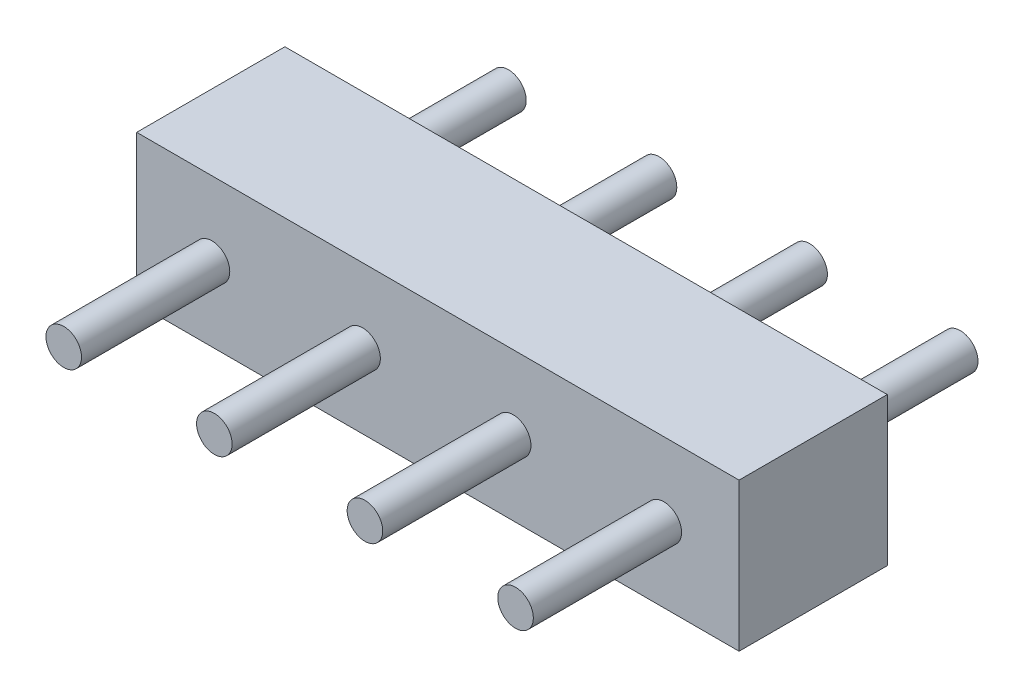
ISO-10303-21;
HEADER;
FILE_DESCRIPTION(('STEP AP214'),'2;1');
FILE_NAME('part.step','',(''),(''),'','','');
FILE_SCHEMA(('AUTOMOTIVE_DESIGN { 1 0 10303 214 1 1 1 1 }'));
ENDSEC;
DATA;
#1=APPLICATION_CONTEXT('core data for automotive mechanical design processes');
#2=APPLICATION_PROTOCOL_DEFINITION('international standard','automotive_design',2000,#1);
#3=PRODUCT_CONTEXT('',#1,'mechanical');
#4=PRODUCT('Part','Part','',(#3));
#5=PRODUCT_RELATED_PRODUCT_CATEGORY('part','',(#4));
#6=PRODUCT_DEFINITION_FORMATION('','',#4);
#7=PRODUCT_DEFINITION_CONTEXT('part definition',#1,'design');
#8=PRODUCT_DEFINITION('design','',#6,#7);
#9=PRODUCT_DEFINITION_SHAPE('','',#8);
#10=(LENGTH_UNIT() NAMED_UNIT(*) SI_UNIT(.MILLI.,.METRE.));
#11=(NAMED_UNIT(*) PLANE_ANGLE_UNIT() SI_UNIT($,.RADIAN.));
#12=(NAMED_UNIT(*) SI_UNIT($,.STERADIAN.) SOLID_ANGLE_UNIT());
#13=UNCERTAINTY_MEASURE_WITH_UNIT(LENGTH_MEASURE(1.E-05),#10,'distance_accuracy_value','');
#14=(GEOMETRIC_REPRESENTATION_CONTEXT(3) GLOBAL_UNCERTAINTY_ASSIGNED_CONTEXT((#13)) GLOBAL_UNIT_ASSIGNED_CONTEXT((#10,
#11,#12)) REPRESENTATION_CONTEXT('',''));
#15=CARTESIAN_POINT('',(0.,0.,0.));
#16=DIRECTION('',(0.,0.,1.));
#17=DIRECTION('',(1.,0.,0.));
#18=AXIS2_PLACEMENT_3D('',#15,#16,#17);
#19=CARTESIAN_POINT('',(0.,0.,2.5));
#20=DIRECTION('',(1.,0.,0.));
#21=DIRECTION('',(0.,0.,-1.));
#22=AXIS2_PLACEMENT_3D('',#19,#20,#21);
#23=PLANE('',#22);
#24=DIRECTION('',(0.,-1.,0.));
#25=VECTOR('',#24,1.);
#26=CARTESIAN_POINT('',(0.,0.,0.));
#27=LINE('',#26,#25);
#28=CARTESIAN_POINT('',(0.,2.5,0.));
#29=VERTEX_POINT('',#28);
#30=CARTESIAN_POINT('',(0.,0.,0.));
#31=VERTEX_POINT('',#30);
#32=EDGE_CURVE('E103',#29,#31,#27,.T.);
#33=ORIENTED_EDGE('',*,*,#32,.T.);
#34=DIRECTION('',(0.,0.,-1.));
#35=VECTOR('',#34,1.);
#36=CARTESIAN_POINT('',(0.,0.,2.5));
#37=LINE('',#36,#35);
#38=CARTESIAN_POINT('',(0.,0.,2.5));
#39=VERTEX_POINT('',#38);
#40=EDGE_CURVE('E94',#39,#31,#37,.T.);
#41=ORIENTED_EDGE('',*,*,#40,.F.);
#42=DIRECTION('',(0.,-1.,0.));
#43=VECTOR('',#42,1.);
#44=CARTESIAN_POINT('',(0.,0.,2.5));
#45=LINE('',#44,#43);
#46=CARTESIAN_POINT('',(0.,2.5,2.5));
#47=VERTEX_POINT('',#46);
#48=EDGE_CURVE('E88',#47,#39,#45,.T.);
#49=ORIENTED_EDGE('',*,*,#48,.F.);
#50=DIRECTION('',(0.,0.,-1.));
#51=VECTOR('',#50,1.);
#52=CARTESIAN_POINT('',(0.,2.5,2.5));
#53=LINE('',#52,#51);
#54=EDGE_CURVE('E99',#47,#29,#53,.T.);
#55=ORIENTED_EDGE('',*,*,#54,.T.);
#56=EDGE_LOOP('',(#33,#41,#49,#55));
#57=FACE_BOUND('',#56,.T.);
#58=ADVANCED_FACE('F36',(#57),#23,.F.);
#59=CARTESIAN_POINT('',(0.,0.,2.5));
#60=DIRECTION('',(0.,1.,0.));
#61=DIRECTION('',(0.,0.,1.));
#62=AXIS2_PLACEMENT_3D('',#59,#60,#61);
#63=PLANE('',#62);
#64=DIRECTION('',(1.,0.,0.));
#65=VECTOR('',#64,1.);
#66=CARTESIAN_POINT('',(0.,0.,0.));
#67=LINE('',#66,#65);
#68=CARTESIAN_POINT('',(10.16,0.,0.));
#69=VERTEX_POINT('',#68);
#70=EDGE_CURVE('E93',#31,#69,#67,.T.);
#71=ORIENTED_EDGE('',*,*,#70,.T.);
#72=DIRECTION('',(0.,0.,-1.));
#73=VECTOR('',#72,1.);
#74=CARTESIAN_POINT('',(10.16,0.,2.5));
#75=LINE('',#74,#73);
#76=CARTESIAN_POINT('',(10.16,0.,2.5));
#77=VERTEX_POINT('',#76);
#78=EDGE_CURVE('E91',#77,#69,#75,.T.);
#79=ORIENTED_EDGE('',*,*,#78,.F.);
#80=DIRECTION('',(1.,0.,0.));
#81=VECTOR('',#80,1.);
#82=CARTESIAN_POINT('',(0.,0.,2.5));
#83=LINE('',#82,#81);
#84=EDGE_CURVE('E83',#39,#77,#83,.T.);
#85=ORIENTED_EDGE('',*,*,#84,.F.);
#86=ORIENTED_EDGE('',*,*,#40,.T.);
#87=EDGE_LOOP('',(#71,#79,#85,#86));
#88=FACE_BOUND('',#87,.T.);
#89=ADVANCED_FACE('F92',(#88),#63,.F.);
#90=CARTESIAN_POINT('',(10.16,0.,2.5));
#91=DIRECTION('',(-1.,0.,0.));
#92=DIRECTION('',(0.,0.,1.));
#93=AXIS2_PLACEMENT_3D('',#90,#91,#92);
#94=PLANE('',#93);
#95=DIRECTION('',(0.,1.,0.));
#96=VECTOR('',#95,1.);
#97=CARTESIAN_POINT('',(10.16,0.,0.));
#98=LINE('',#97,#96);
#99=CARTESIAN_POINT('',(10.16,2.5,0.));
#100=VERTEX_POINT('',#99);
#101=EDGE_CURVE('E69',#69,#100,#98,.T.);
#102=ORIENTED_EDGE('',*,*,#101,.T.);
#103=DIRECTION('',(0.,0.,-1.));
#104=VECTOR('',#103,1.);
#105=CARTESIAN_POINT('',(10.16,2.5,2.5));
#106=LINE('',#105,#104);
#107=CARTESIAN_POINT('',(10.16,2.5,2.5));
#108=VERTEX_POINT('',#107);
#109=EDGE_CURVE('E95',#108,#100,#106,.T.);
#110=ORIENTED_EDGE('',*,*,#109,.F.);
#111=DIRECTION('',(0.,1.,0.));
#112=VECTOR('',#111,1.);
#113=CARTESIAN_POINT('',(10.16,0.,2.5));
#114=LINE('',#113,#112);
#115=EDGE_CURVE('E86',#77,#108,#114,.T.);
#116=ORIENTED_EDGE('',*,*,#115,.F.);
#117=ORIENTED_EDGE('',*,*,#78,.T.);
#118=EDGE_LOOP('',(#102,#110,#116,#117));
#119=FACE_BOUND('',#118,.T.);
#120=ADVANCED_FACE('F97',(#119),#94,.F.);
#121=CARTESIAN_POINT('',(0.,2.5,2.5));
#122=DIRECTION('',(0.,-1.,0.));
#123=DIRECTION('',(0.,0.,-1.));
#124=AXIS2_PLACEMENT_3D('',#121,#122,#123);
#125=PLANE('',#124);
#126=DIRECTION('',(-1.,0.,0.));
#127=VECTOR('',#126,1.);
#128=CARTESIAN_POINT('',(0.,2.5,0.));
#129=LINE('',#128,#127);
#130=EDGE_CURVE('E75',#100,#29,#129,.T.);
#131=ORIENTED_EDGE('',*,*,#130,.T.);
#132=ORIENTED_EDGE('',*,*,#54,.F.);
#133=DIRECTION('',(-1.,0.,0.));
#134=VECTOR('',#133,1.);
#135=CARTESIAN_POINT('',(0.,2.5,2.5));
#136=LINE('',#135,#134);
#137=EDGE_CURVE('E52',#108,#47,#136,.T.);
#138=ORIENTED_EDGE('',*,*,#137,.F.);
#139=ORIENTED_EDGE('',*,*,#109,.T.);
#140=EDGE_LOOP('',(#131,#132,#138,#139));
#141=FACE_BOUND('',#140,.T.);
#142=ADVANCED_FACE('F136',(#141),#125,.F.);
#143=CARTESIAN_POINT('',(0.,0.,2.5));
#144=DIRECTION('',(0.,0.,-1.));
#145=DIRECTION('',(-1.,0.,0.));
#146=AXIS2_PLACEMENT_3D('',#143,#144,#145);
#147=PLANE('',#146);
#148=CARTESIAN_POINT('',(8.89,1.25,2.5));
#149=DIRECTION('',(0.,0.,-1.));
#150=DIRECTION('',(-1.,0.,0.));
#151=AXIS2_PLACEMENT_3D('',#148,#149,#150);
#152=CIRCLE('',#151,0.3);
#153=CARTESIAN_POINT('',(8.59,1.25,2.5));
#154=VERTEX_POINT('',#153);
#155=EDGE_CURVE('E335',#154,#154,#152,.T.);
#156=ORIENTED_EDGE('',*,*,#155,.T.);
#157=EDGE_LOOP('',(#156));
#158=FACE_BOUND('',#157,.T.);
#159=CARTESIAN_POINT('',(6.35,1.25,2.5));
#160=DIRECTION('',(0.,0.,-1.));
#161=DIRECTION('',(-1.,0.,0.));
#162=AXIS2_PLACEMENT_3D('',#159,#160,#161);
#163=CIRCLE('',#162,0.3);
#164=CARTESIAN_POINT('',(6.05,1.25,2.5));
#165=VERTEX_POINT('',#164);
#166=EDGE_CURVE('E346',#165,#165,#163,.T.);
#167=ORIENTED_EDGE('',*,*,#166,.T.);
#168=EDGE_LOOP('',(#167));
#169=FACE_BOUND('',#168,.T.);
#170=CARTESIAN_POINT('',(1.27,1.25,2.5));
#171=DIRECTION('',(0.,0.,-1.));
#172=DIRECTION('',(-1.,0.,0.));
#173=AXIS2_PLACEMENT_3D('',#170,#171,#172);
#174=CIRCLE('',#173,0.3);
#175=CARTESIAN_POINT('',(0.970000000000001,1.25,2.5));
#176=VERTEX_POINT('',#175);
#177=EDGE_CURVE('E355',#176,#176,#174,.T.);
#178=ORIENTED_EDGE('',*,*,#177,.T.);
#179=EDGE_LOOP('',(#178));
#180=FACE_BOUND('',#179,.T.);
#181=CARTESIAN_POINT('',(3.81,1.25,2.5));
#182=DIRECTION('',(0.,0.,-1.));
#183=DIRECTION('',(-1.,0.,0.));
#184=AXIS2_PLACEMENT_3D('',#181,#182,#183);
#185=CIRCLE('',#184,0.3);
#186=CARTESIAN_POINT('',(3.51,1.25,2.5));
#187=VERTEX_POINT('',#186);
#188=EDGE_CURVE('E106',#187,#187,#185,.T.);
#189=ORIENTED_EDGE('',*,*,#188,.T.);
#190=EDGE_LOOP('',(#189));
#191=FACE_BOUND('',#190,.T.);
#192=ORIENTED_EDGE('',*,*,#48,.T.);
#193=ORIENTED_EDGE('',*,*,#84,.T.);
#194=ORIENTED_EDGE('',*,*,#115,.T.);
#195=ORIENTED_EDGE('',*,*,#137,.T.);
#196=EDGE_LOOP('',(#192,#193,#194,#195));
#197=FACE_BOUND('',#196,.T.);
#198=ADVANCED_FACE('F84',(#158,#169,#180,#191,#197),#147,.F.);
#199=CARTESIAN_POINT('',(0.,0.,0.));
#200=DIRECTION('',(0.,0.,-1.));
#201=DIRECTION('',(-1.,0.,0.));
#202=AXIS2_PLACEMENT_3D('',#199,#200,#201);
#203=PLANE('',#202);
#204=CARTESIAN_POINT('',(8.89,1.25,0.));
#205=DIRECTION('',(0.,0.,-1.));
#206=DIRECTION('',(-1.,0.,0.));
#207=AXIS2_PLACEMENT_3D('',#204,#205,#206);
#208=CIRCLE('',#207,0.3);
#209=CARTESIAN_POINT('',(8.59,1.25,0.));
#210=VERTEX_POINT('',#209);
#211=EDGE_CURVE('E11',#210,#210,#208,.T.);
#212=ORIENTED_EDGE('',*,*,#211,.F.);
#213=EDGE_LOOP('',(#212));
#214=FACE_BOUND('',#213,.T.);
#215=CARTESIAN_POINT('',(6.35,1.25,0.));
#216=DIRECTION('',(0.,0.,-1.));
#217=DIRECTION('',(-1.,0.,0.));
#218=AXIS2_PLACEMENT_3D('',#215,#216,#217);
#219=CIRCLE('',#218,0.3);
#220=CARTESIAN_POINT('',(6.05,1.25,0.));
#221=VERTEX_POINT('',#220);
#222=EDGE_CURVE('E44',#221,#221,#219,.T.);
#223=ORIENTED_EDGE('',*,*,#222,.F.);
#224=EDGE_LOOP('',(#223));
#225=FACE_BOUND('',#224,.T.);
#226=CARTESIAN_POINT('',(1.27,1.25,0.));
#227=DIRECTION('',(0.,0.,-1.));
#228=DIRECTION('',(-1.,0.,0.));
#229=AXIS2_PLACEMENT_3D('',#226,#227,#228);
#230=CIRCLE('',#229,0.3);
#231=CARTESIAN_POINT('',(0.970000000000001,1.25,0.));
#232=VERTEX_POINT('',#231);
#233=EDGE_CURVE('E116',#232,#232,#230,.T.);
#234=ORIENTED_EDGE('',*,*,#233,.F.);
#235=EDGE_LOOP('',(#234));
#236=FACE_BOUND('',#235,.T.);
#237=CARTESIAN_POINT('',(3.81,1.25,0.));
#238=DIRECTION('',(0.,0.,-1.));
#239=DIRECTION('',(-1.,0.,0.));
#240=AXIS2_PLACEMENT_3D('',#237,#238,#239);
#241=CIRCLE('',#240,0.3);
#242=CARTESIAN_POINT('',(3.51,1.25,0.));
#243=VERTEX_POINT('',#242);
#244=EDGE_CURVE('E113',#243,#243,#241,.T.);
#245=ORIENTED_EDGE('',*,*,#244,.F.);
#246=EDGE_LOOP('',(#245));
#247=FACE_BOUND('',#246,.T.);
#248=ORIENTED_EDGE('',*,*,#32,.F.);
#249=ORIENTED_EDGE('',*,*,#130,.F.);
#250=ORIENTED_EDGE('',*,*,#101,.F.);
#251=ORIENTED_EDGE('',*,*,#70,.F.);
#252=EDGE_LOOP('',(#248,#249,#250,#251));
#253=FACE_BOUND('',#252,.T.);
#254=ADVANCED_FACE('F124',(#214,#225,#236,#247,#253),#203,.T.);
#255=CARTESIAN_POINT('',(3.81,1.25,-2.5));
#256=DIRECTION('',(0.,0.,1.));
#257=DIRECTION('',(1.,0.,0.));
#258=AXIS2_PLACEMENT_3D('',#255,#256,#257);
#259=PLANE('',#258);
#260=CARTESIAN_POINT('',(3.81,1.25,-2.5));
#261=DIRECTION('',(0.,0.,1.));
#262=DIRECTION('',(1.,0.,0.));
#263=AXIS2_PLACEMENT_3D('',#260,#261,#262);
#264=CIRCLE('',#263,0.3);
#265=CARTESIAN_POINT('',(4.11,1.25,-2.5));
#266=VERTEX_POINT('',#265);
#267=EDGE_CURVE('E361',#266,#266,#264,.T.);
#268=ORIENTED_EDGE('',*,*,#267,.F.);
#269=EDGE_LOOP('',(#268));
#270=FACE_BOUND('',#269,.T.);
#271=ADVANCED_FACE('F127',(#270),#259,.F.);
#272=CARTESIAN_POINT('',(3.81,1.25,-2.5));
#273=DIRECTION('',(0.,0.,1.));
#274=DIRECTION('',(1.,0.,0.));
#275=AXIS2_PLACEMENT_3D('',#272,#273,#274);
#276=CYLINDRICAL_SURFACE('',#275,0.3);
#277=ORIENTED_EDGE('',*,*,#244,.T.);
#278=EDGE_LOOP('',(#277));
#279=FACE_BOUND('',#278,.T.);
#280=ORIENTED_EDGE('',*,*,#267,.T.);
#281=EDGE_LOOP('',(#280));
#282=FACE_BOUND('',#281,.T.);
#283=ADVANCED_FACE('F170',(#279,#282),#276,.T.);
#284=CARTESIAN_POINT('',(3.81,1.25,5.));
#285=DIRECTION('',(0.,0.,1.));
#286=DIRECTION('',(1.,0.,0.));
#287=AXIS2_PLACEMENT_3D('',#284,#285,#286);
#288=CIRCLE('',#287,0.3);
#289=CARTESIAN_POINT('',(4.11,1.25,5.));
#290=VERTEX_POINT('',#289);
#291=EDGE_CURVE('E358',#290,#290,#288,.T.);
#292=ORIENTED_EDGE('',*,*,#291,.F.);
#293=EDGE_LOOP('',(#292));
#294=FACE_BOUND('',#293,.T.);
#295=ORIENTED_EDGE('',*,*,#188,.F.);
#296=EDGE_LOOP('',(#295));
#297=FACE_BOUND('',#296,.T.);
#298=ADVANCED_FACE('F181',(#294,#297),#276,.T.);
#299=CARTESIAN_POINT('',(3.81,1.25,5.));
#300=DIRECTION('',(0.,0.,1.));
#301=DIRECTION('',(1.,0.,0.));
#302=AXIS2_PLACEMENT_3D('',#299,#300,#301);
#303=PLANE('',#302);
#304=ORIENTED_EDGE('',*,*,#291,.T.);
#305=EDGE_LOOP('',(#304));
#306=FACE_BOUND('',#305,.T.);
#307=ADVANCED_FACE('F191',(#306),#303,.T.);
#308=CARTESIAN_POINT('',(1.27,1.25,-2.5));
#309=DIRECTION('',(0.,0.,1.));
#310=DIRECTION('',(1.,0.,0.));
#311=AXIS2_PLACEMENT_3D('',#308,#309,#310);
#312=PLANE('',#311);
#313=CARTESIAN_POINT('',(1.27,1.25,-2.5));
#314=DIRECTION('',(0.,0.,1.));
#315=DIRECTION('',(1.,0.,0.));
#316=AXIS2_PLACEMENT_3D('',#313,#314,#315);
#317=CIRCLE('',#316,0.3);
#318=CARTESIAN_POINT('',(1.57,1.25,-2.5));
#319=VERTEX_POINT('',#318);
#320=EDGE_CURVE('E352',#319,#319,#317,.T.);
#321=ORIENTED_EDGE('',*,*,#320,.F.);
#322=EDGE_LOOP('',(#321));
#323=FACE_BOUND('',#322,.T.);
#324=ADVANCED_FACE('F200',(#323),#312,.F.);
#325=CARTESIAN_POINT('',(1.27,1.25,-2.5));
#326=DIRECTION('',(0.,0.,1.));
#327=DIRECTION('',(1.,0.,0.));
#328=AXIS2_PLACEMENT_3D('',#325,#326,#327);
#329=CYLINDRICAL_SURFACE('',#328,0.3);
#330=ORIENTED_EDGE('',*,*,#233,.T.);
#331=EDGE_LOOP('',(#330));
#332=FACE_BOUND('',#331,.T.);
#333=ORIENTED_EDGE('',*,*,#320,.T.);
#334=EDGE_LOOP('',(#333));
#335=FACE_BOUND('',#334,.T.);
#336=ADVANCED_FACE('F220',(#332,#335),#329,.T.);
#337=CARTESIAN_POINT('',(1.27,1.25,5.));
#338=DIRECTION('',(0.,0.,1.));
#339=DIRECTION('',(1.,0.,0.));
#340=AXIS2_PLACEMENT_3D('',#337,#338,#339);
#341=CIRCLE('',#340,0.3);
#342=CARTESIAN_POINT('',(1.57,1.25,5.));
#343=VERTEX_POINT('',#342);
#344=EDGE_CURVE('E349',#343,#343,#341,.T.);
#345=ORIENTED_EDGE('',*,*,#344,.F.);
#346=EDGE_LOOP('',(#345));
#347=FACE_BOUND('',#346,.T.);
#348=ORIENTED_EDGE('',*,*,#177,.F.);
#349=EDGE_LOOP('',(#348));
#350=FACE_BOUND('',#349,.T.);
#351=ADVANCED_FACE('F230',(#347,#350),#329,.T.);
#352=CARTESIAN_POINT('',(1.27,1.25,5.));
#353=DIRECTION('',(0.,0.,1.));
#354=DIRECTION('',(1.,0.,0.));
#355=AXIS2_PLACEMENT_3D('',#352,#353,#354);
#356=PLANE('',#355);
#357=ORIENTED_EDGE('',*,*,#344,.T.);
#358=EDGE_LOOP('',(#357));
#359=FACE_BOUND('',#358,.T.);
#360=ADVANCED_FACE('F240',(#359),#356,.T.);
#361=CARTESIAN_POINT('',(6.35,1.25,-2.5));
#362=DIRECTION('',(0.,0.,1.));
#363=DIRECTION('',(1.,0.,0.));
#364=AXIS2_PLACEMENT_3D('',#361,#362,#363);
#365=PLANE('',#364);
#366=CARTESIAN_POINT('',(6.35,1.25,-2.5));
#367=DIRECTION('',(0.,0.,1.));
#368=DIRECTION('',(1.,0.,0.));
#369=AXIS2_PLACEMENT_3D('',#366,#367,#368);
#370=CIRCLE('',#369,0.3);
#371=CARTESIAN_POINT('',(6.65,1.25,-2.5));
#372=VERTEX_POINT('',#371);
#373=EDGE_CURVE('E343',#372,#372,#370,.T.);
#374=ORIENTED_EDGE('',*,*,#373,.F.);
#375=EDGE_LOOP('',(#374));
#376=FACE_BOUND('',#375,.T.);
#377=ADVANCED_FACE('F249',(#376),#365,.F.);
#378=CARTESIAN_POINT('',(6.35,1.25,-2.5));
#379=DIRECTION('',(0.,0.,1.));
#380=DIRECTION('',(1.,0.,0.));
#381=AXIS2_PLACEMENT_3D('',#378,#379,#380);
#382=CYLINDRICAL_SURFACE('',#381,0.3);
#383=ORIENTED_EDGE('',*,*,#222,.T.);
#384=EDGE_LOOP('',(#383));
#385=FACE_BOUND('',#384,.T.);
#386=ORIENTED_EDGE('',*,*,#373,.T.);
#387=EDGE_LOOP('',(#386));
#388=FACE_BOUND('',#387,.T.);
#389=ADVANCED_FACE('F121',(#385,#388),#382,.T.);
#390=CARTESIAN_POINT('',(6.35,1.25,5.));
#391=DIRECTION('',(0.,0.,1.));
#392=DIRECTION('',(1.,0.,0.));
#393=AXIS2_PLACEMENT_3D('',#390,#391,#392);
#394=CIRCLE('',#393,0.3);
#395=CARTESIAN_POINT('',(6.65,1.25,5.));
#396=VERTEX_POINT('',#395);
#397=EDGE_CURVE('E340',#396,#396,#394,.T.);
#398=ORIENTED_EDGE('',*,*,#397,.F.);
#399=EDGE_LOOP('',(#398));
#400=FACE_BOUND('',#399,.T.);
#401=ORIENTED_EDGE('',*,*,#166,.F.);
#402=EDGE_LOOP('',(#401));
#403=FACE_BOUND('',#402,.T.);
#404=ADVANCED_FACE('F268',(#400,#403),#382,.T.);
#405=CARTESIAN_POINT('',(6.35,1.25,5.));
#406=DIRECTION('',(0.,0.,1.));
#407=DIRECTION('',(1.,0.,0.));
#408=AXIS2_PLACEMENT_3D('',#405,#406,#407);
#409=PLANE('',#408);
#410=ORIENTED_EDGE('',*,*,#397,.T.);
#411=EDGE_LOOP('',(#410));
#412=FACE_BOUND('',#411,.T.);
#413=ADVANCED_FACE('F277',(#412),#409,.T.);
#414=CARTESIAN_POINT('',(8.89,1.25,-2.5));
#415=DIRECTION('',(0.,0.,1.));
#416=DIRECTION('',(1.,0.,0.));
#417=AXIS2_PLACEMENT_3D('',#414,#415,#416);
#418=PLANE('',#417);
#419=CARTESIAN_POINT('',(8.89,1.25,-2.5));
#420=DIRECTION('',(0.,0.,1.));
#421=DIRECTION('',(1.,0.,0.));
#422=AXIS2_PLACEMENT_3D('',#419,#420,#421);
#423=CIRCLE('',#422,0.3);
#424=CARTESIAN_POINT('',(9.19,1.25,-2.5));
#425=VERTEX_POINT('',#424);
#426=EDGE_CURVE('E332',#425,#425,#423,.T.);
#427=ORIENTED_EDGE('',*,*,#426,.F.);
#428=EDGE_LOOP('',(#427));
#429=FACE_BOUND('',#428,.T.);
#430=ADVANCED_FACE('F286',(#429),#418,.F.);
#431=CARTESIAN_POINT('',(8.89,1.25,-2.5));
#432=DIRECTION('',(0.,0.,1.));
#433=DIRECTION('',(1.,0.,0.));
#434=AXIS2_PLACEMENT_3D('',#431,#432,#433);
#435=CYLINDRICAL_SURFACE('',#434,0.3);
#436=ORIENTED_EDGE('',*,*,#211,.T.);
#437=EDGE_LOOP('',(#436));
#438=FACE_BOUND('',#437,.T.);
#439=ORIENTED_EDGE('',*,*,#426,.T.);
#440=EDGE_LOOP('',(#439));
#441=FACE_BOUND('',#440,.T.);
#442=ADVANCED_FACE('F296',(#438,#441),#435,.T.);
#443=CARTESIAN_POINT('',(8.89,1.25,5.));
#444=DIRECTION('',(0.,0.,1.));
#445=DIRECTION('',(1.,0.,0.));
#446=AXIS2_PLACEMENT_3D('',#443,#444,#445);
#447=CIRCLE('',#446,0.3);
#448=CARTESIAN_POINT('',(9.19,1.25,5.));
#449=VERTEX_POINT('',#448);
#450=EDGE_CURVE('E331',#449,#449,#447,.T.);
#451=ORIENTED_EDGE('',*,*,#450,.F.);
#452=EDGE_LOOP('',(#451));
#453=FACE_BOUND('',#452,.T.);
#454=ORIENTED_EDGE('',*,*,#155,.F.);
#455=EDGE_LOOP('',(#454));
#456=FACE_BOUND('',#455,.T.);
#457=ADVANCED_FACE('F306',(#453,#456),#435,.T.);
#458=CARTESIAN_POINT('',(8.89,1.25,5.));
#459=DIRECTION('',(0.,0.,1.));
#460=DIRECTION('',(1.,0.,0.));
#461=AXIS2_PLACEMENT_3D('',#458,#459,#460);
#462=PLANE('',#461);
#463=ORIENTED_EDGE('',*,*,#450,.T.);
#464=EDGE_LOOP('',(#463));
#465=FACE_BOUND('',#464,.T.);
#466=ADVANCED_FACE('F316',(#465),#462,.T.);
#467=CLOSED_SHELL('',(#58,#89,#120,#142,#198,#254,#271,#283,#298,#307,#324,#336,#351,#360,#377,
#389,#404,#413,#430,#442,#457,#466));
#468=MANIFOLD_SOLID_BREP('B2',#467);
#469=ADVANCED_BREP_SHAPE_REPRESENTATION('',(#18,#468),#14);
#470=SHAPE_DEFINITION_REPRESENTATION(#9,#469);
ENDSEC;
END-ISO-10303-21;
